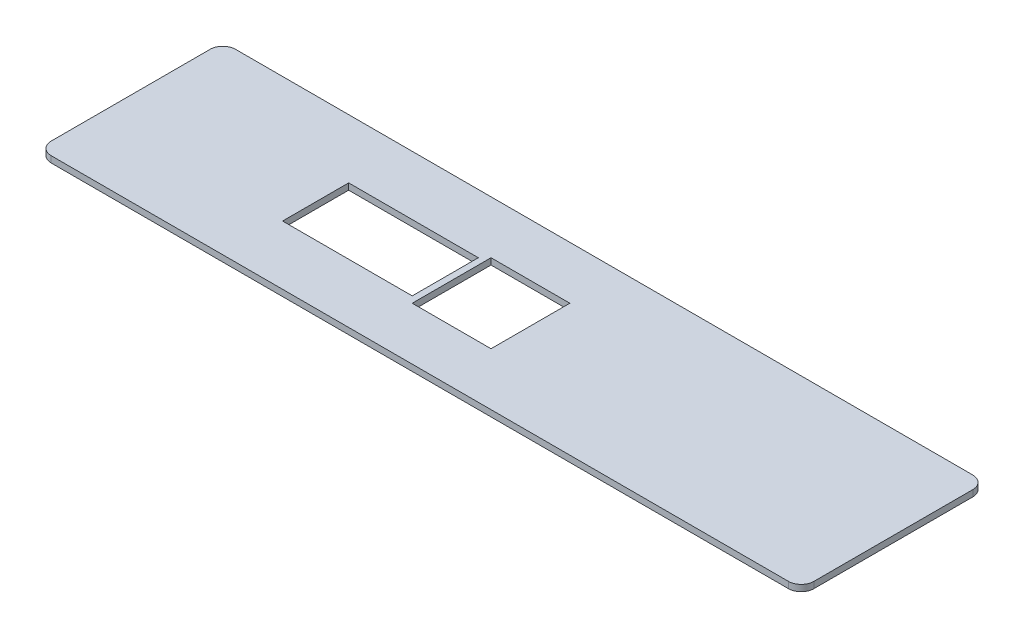
ISO-10303-21;
HEADER;
FILE_DESCRIPTION(('STEP AP214'),'2;1');
FILE_NAME('part.step','',(''),(''),'','','');
FILE_SCHEMA(('AUTOMOTIVE_DESIGN { 1 0 10303 214 1 1 1 1 }'));
ENDSEC;
DATA;
#1=APPLICATION_CONTEXT('core data for automotive mechanical design processes');
#2=APPLICATION_PROTOCOL_DEFINITION('international standard','automotive_design',2000,#1);
#3=PRODUCT_CONTEXT('',#1,'mechanical');
#4=PRODUCT('Part','Part','',(#3));
#5=PRODUCT_RELATED_PRODUCT_CATEGORY('part','',(#4));
#6=PRODUCT_DEFINITION_FORMATION('','',#4);
#7=PRODUCT_DEFINITION_CONTEXT('part definition',#1,'design');
#8=PRODUCT_DEFINITION('design','',#6,#7);
#9=PRODUCT_DEFINITION_SHAPE('','',#8);
#10=(LENGTH_UNIT() NAMED_UNIT(*) SI_UNIT(.MILLI.,.METRE.));
#11=(NAMED_UNIT(*) PLANE_ANGLE_UNIT() SI_UNIT($,.RADIAN.));
#12=(NAMED_UNIT(*) SI_UNIT($,.STERADIAN.) SOLID_ANGLE_UNIT());
#13=UNCERTAINTY_MEASURE_WITH_UNIT(LENGTH_MEASURE(1.E-05),#10,'distance_accuracy_value','');
#14=(GEOMETRIC_REPRESENTATION_CONTEXT(3) GLOBAL_UNCERTAINTY_ASSIGNED_CONTEXT((#13)) GLOBAL_UNIT_ASSIGNED_CONTEXT((#10,
#11,#12)) REPRESENTATION_CONTEXT('',''));
#15=CARTESIAN_POINT('',(0.,0.,0.));
#16=DIRECTION('',(0.,0.,1.));
#17=DIRECTION('',(1.,0.,0.));
#18=AXIS2_PLACEMENT_3D('',#15,#16,#17);
#19=CARTESIAN_POINT('',(118.,1.,-12.5));
#20=DIRECTION('',(0.,-1.,0.));
#21=DIRECTION('',(0.,0.,-1.));
#22=AXIS2_PLACEMENT_3D('',#19,#20,#21);
#23=PLANE('',#22);
#24=DIRECTION('',(0.,0.,1.));
#25=VECTOR('',#24,1.);
#26=CARTESIAN_POINT('',(29.1,1.,-5.2));
#27=LINE('',#26,#25);
#28=CARTESIAN_POINT('',(29.1,1.,-5.2));
#29=VERTEX_POINT('',#28);
#30=CARTESIAN_POINT('',(29.1,1.,5.2));
#31=VERTEX_POINT('',#30);
#32=EDGE_CURVE('E207',#29,#31,#27,.T.);
#33=ORIENTED_EDGE('',*,*,#32,.F.);
#34=DIRECTION('',(-1.,0.,0.));
#35=VECTOR('',#34,1.);
#36=CARTESIAN_POINT('',(29.1,1.,-5.2));
#37=LINE('',#36,#35);
#38=CARTESIAN_POINT('',(49.5,1.,-5.2));
#39=VERTEX_POINT('',#38);
#40=EDGE_CURVE('E218',#39,#29,#37,.T.);
#41=ORIENTED_EDGE('',*,*,#40,.F.);
#42=DIRECTION('',(0.,0.,-1.));
#43=VECTOR('',#42,1.);
#44=CARTESIAN_POINT('',(49.5,1.,-5.2));
#45=LINE('',#44,#43);
#46=CARTESIAN_POINT('',(49.5,1.,5.2));
#47=VERTEX_POINT('',#46);
#48=EDGE_CURVE('E214',#47,#39,#45,.T.);
#49=ORIENTED_EDGE('',*,*,#48,.F.);
#50=DIRECTION('',(1.,0.,0.));
#51=VECTOR('',#50,1.);
#52=CARTESIAN_POINT('',(29.1,1.,5.2));
#53=LINE('',#52,#51);
#54=EDGE_CURVE('E210',#31,#47,#53,.T.);
#55=ORIENTED_EDGE('',*,*,#54,.F.);
#56=EDGE_LOOP('',(#33,#41,#49,#55));
#57=FACE_BOUND('',#56,.T.);
#58=CARTESIAN_POINT('',(118.,1.,-12.5));
#59=DIRECTION('',(0.,1.,0.));
#60=DIRECTION('',(0.,0.,-1.));
#61=AXIS2_PLACEMENT_3D('',#58,#59,#60);
#62=CIRCLE('',#61,2.);
#63=CARTESIAN_POINT('',(120.,1.,-12.5));
#64=VERTEX_POINT('',#63);
#65=CARTESIAN_POINT('',(118.,1.,-14.5));
#66=VERTEX_POINT('',#65);
#67=EDGE_CURVE('E250',#64,#66,#62,.T.);
#68=ORIENTED_EDGE('',*,*,#67,.T.);
#69=DIRECTION('',(-1.,0.,0.));
#70=VECTOR('',#69,1.);
#71=CARTESIAN_POINT('',(118.,1.,-14.5));
#72=LINE('',#71,#70);
#73=CARTESIAN_POINT('',(2.00000000000001,1.,-14.5));
#74=VERTEX_POINT('',#73);
#75=EDGE_CURVE('E254',#66,#74,#72,.T.);
#76=ORIENTED_EDGE('',*,*,#75,.T.);
#77=CARTESIAN_POINT('',(1.99999999999999,1.,-12.5));
#78=DIRECTION('',(0.,1.,0.));
#79=DIRECTION('',(0.,0.,1.));
#80=AXIS2_PLACEMENT_3D('',#77,#78,#79);
#81=CIRCLE('',#80,2.);
#82=CARTESIAN_POINT('',(0.,1.,-12.5));
#83=VERTEX_POINT('',#82);
#84=EDGE_CURVE('E258',#74,#83,#81,.T.);
#85=ORIENTED_EDGE('',*,*,#84,.T.);
#86=DIRECTION('',(0.,0.,1.));
#87=VECTOR('',#86,1.);
#88=CARTESIAN_POINT('',(0.,1.,-12.5));
#89=LINE('',#88,#87);
#90=CARTESIAN_POINT('',(0.,1.,12.5));
#91=VERTEX_POINT('',#90);
#92=EDGE_CURVE('E261',#83,#91,#89,.T.);
#93=ORIENTED_EDGE('',*,*,#92,.T.);
#94=CARTESIAN_POINT('',(2.,1.,12.5));
#95=DIRECTION('',(0.,1.,0.));
#96=DIRECTION('',(0.,0.,-1.));
#97=AXIS2_PLACEMENT_3D('',#94,#95,#96);
#98=CIRCLE('',#97,2.);
#99=CARTESIAN_POINT('',(2.00000000000001,1.,14.5));
#100=VERTEX_POINT('',#99);
#101=EDGE_CURVE('E264',#91,#100,#98,.T.);
#102=ORIENTED_EDGE('',*,*,#101,.T.);
#103=DIRECTION('',(1.,0.,0.));
#104=VECTOR('',#103,1.);
#105=CARTESIAN_POINT('',(2.00000000000001,1.,14.5));
#106=LINE('',#105,#104);
#107=CARTESIAN_POINT('',(118.,1.,14.4999999999999));
#108=VERTEX_POINT('',#107);
#109=EDGE_CURVE('E267',#100,#108,#106,.T.);
#110=ORIENTED_EDGE('',*,*,#109,.T.);
#111=CARTESIAN_POINT('',(118.,1.,12.4999999999999));
#112=DIRECTION('',(0.,1.,0.));
#113=DIRECTION('',(0.,0.,-1.));
#114=AXIS2_PLACEMENT_3D('',#111,#112,#113);
#115=CIRCLE('',#114,2.);
#116=CARTESIAN_POINT('',(120.,1.,12.4999999999999));
#117=VERTEX_POINT('',#116);
#118=EDGE_CURVE('E270',#108,#117,#115,.T.);
#119=ORIENTED_EDGE('',*,*,#118,.T.);
#120=DIRECTION('',(0.,0.,-1.));
#121=VECTOR('',#120,1.);
#122=CARTESIAN_POINT('',(120.,1.,12.4999999999999));
#123=LINE('',#122,#121);
#124=EDGE_CURVE('E273',#117,#64,#123,.T.);
#125=ORIENTED_EDGE('',*,*,#124,.T.);
#126=EDGE_LOOP('',(#68,#76,#85,#93,#102,#110,#119,#125));
#127=FACE_BOUND('',#126,.T.);
#128=DIRECTION('',(0.,0.,1.));
#129=VECTOR('',#128,1.);
#130=CARTESIAN_POINT('',(50.5,1.,-6.2));
#131=LINE('',#130,#129);
#132=CARTESIAN_POINT('',(50.5,1.,-6.2));
#133=VERTEX_POINT('',#132);
#134=CARTESIAN_POINT('',(50.5,1.,6.2));
#135=VERTEX_POINT('',#134);
#136=EDGE_CURVE('E159',#133,#135,#131,.T.);
#137=ORIENTED_EDGE('',*,*,#136,.F.);
#138=DIRECTION('',(-1.,0.,0.));
#139=VECTOR('',#138,1.);
#140=CARTESIAN_POINT('',(50.5,1.,-6.2));
#141=LINE('',#140,#139);
#142=CARTESIAN_POINT('',(62.9,1.,-6.2));
#143=VERTEX_POINT('',#142);
#144=EDGE_CURVE('E185',#143,#133,#141,.T.);
#145=ORIENTED_EDGE('',*,*,#144,.F.);
#146=DIRECTION('',(0.,0.,-1.));
#147=VECTOR('',#146,1.);
#148=CARTESIAN_POINT('',(62.9,1.,-6.2));
#149=LINE('',#148,#147);
#150=CARTESIAN_POINT('',(62.9,1.,6.2));
#151=VERTEX_POINT('',#150);
#152=EDGE_CURVE('E181',#151,#143,#149,.T.);
#153=ORIENTED_EDGE('',*,*,#152,.F.);
#154=DIRECTION('',(1.,0.,0.));
#155=VECTOR('',#154,1.);
#156=CARTESIAN_POINT('',(50.5,1.,6.2));
#157=LINE('',#156,#155);
#158=EDGE_CURVE('E168',#135,#151,#157,.T.);
#159=ORIENTED_EDGE('',*,*,#158,.F.);
#160=EDGE_LOOP('',(#137,#145,#153,#159));
#161=FACE_BOUND('',#160,.T.);
#162=ADVANCED_FACE('F45',(#57,#127,#161),#23,.F.);
#163=CARTESIAN_POINT('',(118.,0.,-12.5));
#164=DIRECTION('',(0.,-1.,0.));
#165=DIRECTION('',(0.,0.,-1.));
#166=AXIS2_PLACEMENT_3D('',#163,#164,#165);
#167=PLANE('',#166);
#168=CARTESIAN_POINT('',(118.,0.,-12.5));
#169=DIRECTION('',(0.,1.,0.));
#170=DIRECTION('',(0.,0.,-1.));
#171=AXIS2_PLACEMENT_3D('',#168,#169,#170);
#172=CIRCLE('',#171,2.);
#173=CARTESIAN_POINT('',(120.,0.,-12.5));
#174=VERTEX_POINT('',#173);
#175=CARTESIAN_POINT('',(118.,0.,-14.5));
#176=VERTEX_POINT('',#175);
#177=EDGE_CURVE('E249',#174,#176,#172,.T.);
#178=ORIENTED_EDGE('',*,*,#177,.F.);
#179=DIRECTION('',(0.,0.,-1.));
#180=VECTOR('',#179,1.);
#181=CARTESIAN_POINT('',(120.,0.,12.4999999999999));
#182=LINE('',#181,#180);
#183=CARTESIAN_POINT('',(120.,0.,12.4999999999999));
#184=VERTEX_POINT('',#183);
#185=EDGE_CURVE('E255',#184,#174,#182,.T.);
#186=ORIENTED_EDGE('',*,*,#185,.F.);
#187=CARTESIAN_POINT('',(118.,0.,12.4999999999999));
#188=DIRECTION('',(0.,1.,0.));
#189=DIRECTION('',(0.,0.,-1.));
#190=AXIS2_PLACEMENT_3D('',#187,#188,#189);
#191=CIRCLE('',#190,2.);
#192=CARTESIAN_POINT('',(118.,0.,14.4999999999999));
#193=VERTEX_POINT('',#192);
#194=EDGE_CURVE('E295',#193,#184,#191,.T.);
#195=ORIENTED_EDGE('',*,*,#194,.F.);
#196=DIRECTION('',(1.,0.,0.));
#197=VECTOR('',#196,1.);
#198=CARTESIAN_POINT('',(2.00000000000001,0.,14.5));
#199=LINE('',#198,#197);
#200=CARTESIAN_POINT('',(2.00000000000001,0.,14.5));
#201=VERTEX_POINT('',#200);
#202=EDGE_CURVE('E292',#201,#193,#199,.T.);
#203=ORIENTED_EDGE('',*,*,#202,.F.);
#204=CARTESIAN_POINT('',(2.,0.,12.5));
#205=DIRECTION('',(0.,1.,0.));
#206=DIRECTION('',(0.,0.,-1.));
#207=AXIS2_PLACEMENT_3D('',#204,#205,#206);
#208=CIRCLE('',#207,2.);
#209=CARTESIAN_POINT('',(0.,0.,12.5));
#210=VERTEX_POINT('',#209);
#211=EDGE_CURVE('E289',#210,#201,#208,.T.);
#212=ORIENTED_EDGE('',*,*,#211,.F.);
#213=DIRECTION('',(0.,0.,1.));
#214=VECTOR('',#213,1.);
#215=CARTESIAN_POINT('',(0.,0.,-12.5));
#216=LINE('',#215,#214);
#217=CARTESIAN_POINT('',(0.,0.,-12.5));
#218=VERTEX_POINT('',#217);
#219=EDGE_CURVE('E286',#218,#210,#216,.T.);
#220=ORIENTED_EDGE('',*,*,#219,.F.);
#221=CARTESIAN_POINT('',(1.99999999999999,0.,-12.5));
#222=DIRECTION('',(0.,1.,0.));
#223=DIRECTION('',(0.,0.,1.));
#224=AXIS2_PLACEMENT_3D('',#221,#222,#223);
#225=CIRCLE('',#224,2.);
#226=CARTESIAN_POINT('',(2.00000000000001,0.,-14.5));
#227=VERTEX_POINT('',#226);
#228=EDGE_CURVE('E283',#227,#218,#225,.T.);
#229=ORIENTED_EDGE('',*,*,#228,.F.);
#230=DIRECTION('',(-1.,0.,0.));
#231=VECTOR('',#230,1.);
#232=CARTESIAN_POINT('',(118.,0.,-14.5));
#233=LINE('',#232,#231);
#234=EDGE_CURVE('E280',#176,#227,#233,.T.);
#235=ORIENTED_EDGE('',*,*,#234,.F.);
#236=EDGE_LOOP('',(#178,#186,#195,#203,#212,#220,#229,#235));
#237=FACE_BOUND('',#236,.T.);
#238=DIRECTION('',(-1.,0.,0.));
#239=VECTOR('',#238,1.);
#240=CARTESIAN_POINT('',(29.1,0.,-5.2));
#241=LINE('',#240,#239);
#242=CARTESIAN_POINT('',(49.5,0.,-5.2));
#243=VERTEX_POINT('',#242);
#244=CARTESIAN_POINT('',(29.1,0.,-5.2));
#245=VERTEX_POINT('',#244);
#246=EDGE_CURVE('E211',#243,#245,#241,.T.);
#247=ORIENTED_EDGE('',*,*,#246,.T.);
#248=DIRECTION('',(0.,0.,1.));
#249=VECTOR('',#248,1.);
#250=CARTESIAN_POINT('',(29.1,0.,-5.2));
#251=LINE('',#250,#249);
#252=CARTESIAN_POINT('',(29.1,0.,5.2));
#253=VERTEX_POINT('',#252);
#254=EDGE_CURVE('E177',#245,#253,#251,.T.);
#255=ORIENTED_EDGE('',*,*,#254,.T.);
#256=DIRECTION('',(1.,0.,0.));
#257=VECTOR('',#256,1.);
#258=CARTESIAN_POINT('',(29.1,0.,5.2));
#259=LINE('',#258,#257);
#260=CARTESIAN_POINT('',(49.5,0.,5.2));
#261=VERTEX_POINT('',#260);
#262=EDGE_CURVE('E225',#253,#261,#259,.T.);
#263=ORIENTED_EDGE('',*,*,#262,.T.);
#264=DIRECTION('',(0.,0.,-1.));
#265=VECTOR('',#264,1.);
#266=CARTESIAN_POINT('',(49.5,0.,-5.2));
#267=LINE('',#266,#265);
#268=EDGE_CURVE('E229',#261,#243,#267,.T.);
#269=ORIENTED_EDGE('',*,*,#268,.T.);
#270=EDGE_LOOP('',(#247,#255,#263,#269));
#271=FACE_BOUND('',#270,.T.);
#272=DIRECTION('',(-1.,0.,0.));
#273=VECTOR('',#272,1.);
#274=CARTESIAN_POINT('',(50.5,0.,-6.2));
#275=LINE('',#274,#273);
#276=CARTESIAN_POINT('',(62.9,0.,-6.2));
#277=VERTEX_POINT('',#276);
#278=CARTESIAN_POINT('',(50.5,0.,-6.2));
#279=VERTEX_POINT('',#278);
#280=EDGE_CURVE('E169',#277,#279,#275,.T.);
#281=ORIENTED_EDGE('',*,*,#280,.T.);
#282=DIRECTION('',(0.,0.,1.));
#283=VECTOR('',#282,1.);
#284=CARTESIAN_POINT('',(50.5,0.,-6.2));
#285=LINE('',#284,#283);
#286=CARTESIAN_POINT('',(50.5,0.,6.2));
#287=VERTEX_POINT('',#286);
#288=EDGE_CURVE('E69',#279,#287,#285,.T.);
#289=ORIENTED_EDGE('',*,*,#288,.T.);
#290=DIRECTION('',(1.,0.,0.));
#291=VECTOR('',#290,1.);
#292=CARTESIAN_POINT('',(50.5,0.,6.2));
#293=LINE('',#292,#291);
#294=CARTESIAN_POINT('',(62.9,0.,6.2));
#295=VERTEX_POINT('',#294);
#296=EDGE_CURVE('E175',#287,#295,#293,.T.);
#297=ORIENTED_EDGE('',*,*,#296,.T.);
#298=DIRECTION('',(0.,0.,-1.));
#299=VECTOR('',#298,1.);
#300=CARTESIAN_POINT('',(62.9,0.,-6.2));
#301=LINE('',#300,#299);
#302=EDGE_CURVE('E194',#295,#277,#301,.T.);
#303=ORIENTED_EDGE('',*,*,#302,.T.);
#304=EDGE_LOOP('',(#281,#289,#297,#303));
#305=FACE_BOUND('',#304,.T.);
#306=ADVANCED_FACE('F334',(#237,#271,#305),#167,.T.);
#307=CARTESIAN_POINT('',(118.,1.,-12.5));
#308=DIRECTION('',(0.,-1.,0.));
#309=DIRECTION('',(0.,0.,-1.));
#310=AXIS2_PLACEMENT_3D('',#307,#308,#309);
#311=CYLINDRICAL_SURFACE('',#310,2.);
#312=ORIENTED_EDGE('',*,*,#177,.T.);
#313=DIRECTION('',(0.,-1.,0.));
#314=VECTOR('',#313,1.);
#315=CARTESIAN_POINT('',(118.,1.,-14.5));
#316=LINE('',#315,#314);
#317=EDGE_CURVE('E11',#66,#176,#316,.T.);
#318=ORIENTED_EDGE('',*,*,#317,.F.);
#319=ORIENTED_EDGE('',*,*,#67,.F.);
#320=DIRECTION('',(0.,-1.,0.));
#321=VECTOR('',#320,1.);
#322=CARTESIAN_POINT('',(120.,1.,-12.5));
#323=LINE('',#322,#321);
#324=EDGE_CURVE('E276',#64,#174,#323,.T.);
#325=ORIENTED_EDGE('',*,*,#324,.T.);
#326=EDGE_LOOP('',(#312,#318,#319,#325));
#327=FACE_BOUND('',#326,.T.);
#328=ADVANCED_FACE('F47',(#327),#311,.T.);
#329=CARTESIAN_POINT('',(118.,1.,-14.5));
#330=DIRECTION('',(0.,0.,1.));
#331=DIRECTION('',(1.,0.,0.));
#332=AXIS2_PLACEMENT_3D('',#329,#330,#331);
#333=PLANE('',#332);
#334=ORIENTED_EDGE('',*,*,#234,.T.);
#335=DIRECTION('',(0.,-1.,0.));
#336=VECTOR('',#335,1.);
#337=CARTESIAN_POINT('',(2.00000000000001,1.,-14.5));
#338=LINE('',#337,#336);
#339=EDGE_CURVE('E54',#74,#227,#338,.T.);
#340=ORIENTED_EDGE('',*,*,#339,.F.);
#341=ORIENTED_EDGE('',*,*,#75,.F.);
#342=ORIENTED_EDGE('',*,*,#317,.T.);
#343=EDGE_LOOP('',(#334,#340,#341,#342));
#344=FACE_BOUND('',#343,.T.);
#345=ADVANCED_FACE('F351',(#344),#333,.F.);
#346=CARTESIAN_POINT('',(1.99999999999999,1.,-12.5));
#347=DIRECTION('',(0.,-1.,0.));
#348=DIRECTION('',(0.,0.,-1.));
#349=AXIS2_PLACEMENT_3D('',#346,#347,#348);
#350=CYLINDRICAL_SURFACE('',#349,2.);
#351=ORIENTED_EDGE('',*,*,#228,.T.);
#352=DIRECTION('',(0.,-1.,0.));
#353=VECTOR('',#352,1.);
#354=CARTESIAN_POINT('',(0.,1.,-12.5));
#355=LINE('',#354,#353);
#356=EDGE_CURVE('E319',#83,#218,#355,.T.);
#357=ORIENTED_EDGE('',*,*,#356,.F.);
#358=ORIENTED_EDGE('',*,*,#84,.F.);
#359=ORIENTED_EDGE('',*,*,#339,.T.);
#360=EDGE_LOOP('',(#351,#357,#358,#359));
#361=FACE_BOUND('',#360,.T.);
#362=ADVANCED_FACE('F328',(#361),#350,.T.);
#363=CARTESIAN_POINT('',(0.,1.,-12.5));
#364=DIRECTION('',(1.,0.,0.));
#365=DIRECTION('',(0.,0.,-1.));
#366=AXIS2_PLACEMENT_3D('',#363,#364,#365);
#367=PLANE('',#366);
#368=ORIENTED_EDGE('',*,*,#219,.T.);
#369=DIRECTION('',(0.,-1.,0.));
#370=VECTOR('',#369,1.);
#371=CARTESIAN_POINT('',(0.,1.,12.5));
#372=LINE('',#371,#370);
#373=EDGE_CURVE('E315',#91,#210,#372,.T.);
#374=ORIENTED_EDGE('',*,*,#373,.F.);
#375=ORIENTED_EDGE('',*,*,#92,.F.);
#376=ORIENTED_EDGE('',*,*,#356,.T.);
#377=EDGE_LOOP('',(#368,#374,#375,#376));
#378=FACE_BOUND('',#377,.T.);
#379=ADVANCED_FACE('F340',(#378),#367,.F.);
#380=CARTESIAN_POINT('',(2.,1.,12.5));
#381=DIRECTION('',(0.,-1.,0.));
#382=DIRECTION('',(0.,0.,-1.));
#383=AXIS2_PLACEMENT_3D('',#380,#381,#382);
#384=CYLINDRICAL_SURFACE('',#383,2.);
#385=ORIENTED_EDGE('',*,*,#211,.T.);
#386=DIRECTION('',(0.,-1.,0.));
#387=VECTOR('',#386,1.);
#388=CARTESIAN_POINT('',(2.00000000000001,1.,14.5));
#389=LINE('',#388,#387);
#390=EDGE_CURVE('E311',#100,#201,#389,.T.);
#391=ORIENTED_EDGE('',*,*,#390,.F.);
#392=ORIENTED_EDGE('',*,*,#101,.F.);
#393=ORIENTED_EDGE('',*,*,#373,.T.);
#394=EDGE_LOOP('',(#385,#391,#392,#393));
#395=FACE_BOUND('',#394,.T.);
#396=ADVANCED_FACE('F344',(#395),#384,.T.);
#397=CARTESIAN_POINT('',(2.00000000000001,1.,14.5));
#398=DIRECTION('',(0.,0.,-1.));
#399=DIRECTION('',(-1.,0.,0.));
#400=AXIS2_PLACEMENT_3D('',#397,#398,#399);
#401=PLANE('',#400);
#402=ORIENTED_EDGE('',*,*,#202,.T.);
#403=DIRECTION('',(0.,-1.,0.));
#404=VECTOR('',#403,1.);
#405=CARTESIAN_POINT('',(118.,1.,14.4999999999999));
#406=LINE('',#405,#404);
#407=EDGE_CURVE('E307',#108,#193,#406,.T.);
#408=ORIENTED_EDGE('',*,*,#407,.F.);
#409=ORIENTED_EDGE('',*,*,#109,.F.);
#410=ORIENTED_EDGE('',*,*,#390,.T.);
#411=EDGE_LOOP('',(#402,#408,#409,#410));
#412=FACE_BOUND('',#411,.T.);
#413=ADVANCED_FACE('F364',(#412),#401,.F.);
#414=CARTESIAN_POINT('',(118.,1.,12.4999999999999));
#415=DIRECTION('',(0.,-1.,0.));
#416=DIRECTION('',(0.,0.,-1.));
#417=AXIS2_PLACEMENT_3D('',#414,#415,#416);
#418=CYLINDRICAL_SURFACE('',#417,2.);
#419=ORIENTED_EDGE('',*,*,#194,.T.);
#420=DIRECTION('',(0.,-1.,0.));
#421=VECTOR('',#420,1.);
#422=CARTESIAN_POINT('',(120.,1.,12.4999999999999));
#423=LINE('',#422,#421);
#424=EDGE_CURVE('E303',#117,#184,#423,.T.);
#425=ORIENTED_EDGE('',*,*,#424,.F.);
#426=ORIENTED_EDGE('',*,*,#118,.F.);
#427=ORIENTED_EDGE('',*,*,#407,.T.);
#428=EDGE_LOOP('',(#419,#425,#426,#427));
#429=FACE_BOUND('',#428,.T.);
#430=ADVANCED_FACE('F362',(#429),#418,.T.);
#431=CARTESIAN_POINT('',(120.,1.,12.4999999999999));
#432=DIRECTION('',(-1.,0.,0.));
#433=DIRECTION('',(0.,0.,1.));
#434=AXIS2_PLACEMENT_3D('',#431,#432,#433);
#435=PLANE('',#434);
#436=ORIENTED_EDGE('',*,*,#185,.T.);
#437=ORIENTED_EDGE('',*,*,#324,.F.);
#438=ORIENTED_EDGE('',*,*,#124,.F.);
#439=ORIENTED_EDGE('',*,*,#424,.T.);
#440=EDGE_LOOP('',(#436,#437,#438,#439));
#441=FACE_BOUND('',#440,.T.);
#442=ADVANCED_FACE('F357',(#441),#435,.F.);
#443=CARTESIAN_POINT('',(29.1,1.,-5.2));
#444=DIRECTION('',(1.,0.,0.));
#445=DIRECTION('',(0.,0.,-1.));
#446=AXIS2_PLACEMENT_3D('',#443,#444,#445);
#447=PLANE('',#446);
#448=ORIENTED_EDGE('',*,*,#254,.F.);
#449=DIRECTION('',(0.,-1.,0.));
#450=VECTOR('',#449,1.);
#451=CARTESIAN_POINT('',(29.1,1.,-5.2));
#452=LINE('',#451,#450);
#453=EDGE_CURVE('E221',#29,#245,#452,.T.);
#454=ORIENTED_EDGE('',*,*,#453,.F.);
#455=ORIENTED_EDGE('',*,*,#32,.T.);
#456=DIRECTION('',(0.,-1.,0.));
#457=VECTOR('',#456,1.);
#458=CARTESIAN_POINT('',(29.1,1.,5.2));
#459=LINE('',#458,#457);
#460=EDGE_CURVE('E245',#31,#253,#459,.T.);
#461=ORIENTED_EDGE('',*,*,#460,.T.);
#462=EDGE_LOOP('',(#448,#454,#455,#461));
#463=FACE_BOUND('',#462,.T.);
#464=ADVANCED_FACE('F382',(#463),#447,.T.);
#465=CARTESIAN_POINT('',(29.1,1.,5.2));
#466=DIRECTION('',(0.,0.,-1.));
#467=DIRECTION('',(-1.,0.,0.));
#468=AXIS2_PLACEMENT_3D('',#465,#466,#467);
#469=PLANE('',#468);
#470=ORIENTED_EDGE('',*,*,#262,.F.);
#471=ORIENTED_EDGE('',*,*,#460,.F.);
#472=ORIENTED_EDGE('',*,*,#54,.T.);
#473=DIRECTION('',(0.,-1.,0.));
#474=VECTOR('',#473,1.);
#475=CARTESIAN_POINT('',(49.5,1.,5.2));
#476=LINE('',#475,#474);
#477=EDGE_CURVE('E242',#47,#261,#476,.T.);
#478=ORIENTED_EDGE('',*,*,#477,.T.);
#479=EDGE_LOOP('',(#470,#471,#472,#478));
#480=FACE_BOUND('',#479,.T.);
#481=ADVANCED_FACE('F389',(#480),#469,.T.);
#482=CARTESIAN_POINT('',(49.5,1.,-5.2));
#483=DIRECTION('',(-1.,0.,0.));
#484=DIRECTION('',(0.,0.,1.));
#485=AXIS2_PLACEMENT_3D('',#482,#483,#484);
#486=PLANE('',#485);
#487=ORIENTED_EDGE('',*,*,#268,.F.);
#488=ORIENTED_EDGE('',*,*,#477,.F.);
#489=ORIENTED_EDGE('',*,*,#48,.T.);
#490=DIRECTION('',(0.,-1.,0.));
#491=VECTOR('',#490,1.);
#492=CARTESIAN_POINT('',(49.5,1.,-5.2));
#493=LINE('',#492,#491);
#494=EDGE_CURVE('E239',#39,#243,#493,.T.);
#495=ORIENTED_EDGE('',*,*,#494,.T.);
#496=EDGE_LOOP('',(#487,#488,#489,#495));
#497=FACE_BOUND('',#496,.T.);
#498=ADVANCED_FACE('F394',(#497),#486,.T.);
#499=CARTESIAN_POINT('',(29.1,1.,-5.2));
#500=DIRECTION('',(0.,0.,1.));
#501=DIRECTION('',(1.,0.,0.));
#502=AXIS2_PLACEMENT_3D('',#499,#500,#501);
#503=PLANE('',#502);
#504=ORIENTED_EDGE('',*,*,#246,.F.);
#505=ORIENTED_EDGE('',*,*,#494,.F.);
#506=ORIENTED_EDGE('',*,*,#40,.T.);
#507=ORIENTED_EDGE('',*,*,#453,.T.);
#508=EDGE_LOOP('',(#504,#505,#506,#507));
#509=FACE_BOUND('',#508,.T.);
#510=ADVANCED_FACE('F400',(#509),#503,.T.);
#511=CARTESIAN_POINT('',(50.5,1.,-6.2));
#512=DIRECTION('',(1.,0.,0.));
#513=DIRECTION('',(0.,0.,-1.));
#514=AXIS2_PLACEMENT_3D('',#511,#512,#513);
#515=PLANE('',#514);
#516=ORIENTED_EDGE('',*,*,#288,.F.);
#517=DIRECTION('',(0.,-1.,0.));
#518=VECTOR('',#517,1.);
#519=CARTESIAN_POINT('',(50.5,1.,-6.2));
#520=LINE('',#519,#518);
#521=EDGE_CURVE('E163',#133,#279,#520,.T.);
#522=ORIENTED_EDGE('',*,*,#521,.F.);
#523=ORIENTED_EDGE('',*,*,#136,.T.);
#524=DIRECTION('',(0.,-1.,0.));
#525=VECTOR('',#524,1.);
#526=CARTESIAN_POINT('',(50.5,1.,6.2));
#527=LINE('',#526,#525);
#528=EDGE_CURVE('E162',#135,#287,#527,.T.);
#529=ORIENTED_EDGE('',*,*,#528,.T.);
#530=EDGE_LOOP('',(#516,#522,#523,#529));
#531=FACE_BOUND('',#530,.T.);
#532=ADVANCED_FACE('F161',(#531),#515,.T.);
#533=CARTESIAN_POINT('',(50.5,1.,6.2));
#534=DIRECTION('',(0.,0.,-1.));
#535=DIRECTION('',(-1.,0.,0.));
#536=AXIS2_PLACEMENT_3D('',#533,#534,#535);
#537=PLANE('',#536);
#538=ORIENTED_EDGE('',*,*,#296,.F.);
#539=ORIENTED_EDGE('',*,*,#528,.F.);
#540=ORIENTED_EDGE('',*,*,#158,.T.);
#541=DIRECTION('',(0.,-1.,0.));
#542=VECTOR('',#541,1.);
#543=CARTESIAN_POINT('',(62.9,1.,6.2));
#544=LINE('',#543,#542);
#545=EDGE_CURVE('E178',#151,#295,#544,.T.);
#546=ORIENTED_EDGE('',*,*,#545,.T.);
#547=EDGE_LOOP('',(#538,#539,#540,#546));
#548=FACE_BOUND('',#547,.T.);
#549=ADVANCED_FACE('F172',(#548),#537,.T.);
#550=CARTESIAN_POINT('',(62.9,1.,-6.2));
#551=DIRECTION('',(-1.,0.,0.));
#552=DIRECTION('',(0.,0.,1.));
#553=AXIS2_PLACEMENT_3D('',#550,#551,#552);
#554=PLANE('',#553);
#555=ORIENTED_EDGE('',*,*,#302,.F.);
#556=ORIENTED_EDGE('',*,*,#545,.F.);
#557=ORIENTED_EDGE('',*,*,#152,.T.);
#558=DIRECTION('',(0.,-1.,0.));
#559=VECTOR('',#558,1.);
#560=CARTESIAN_POINT('',(62.9,1.,-6.2));
#561=LINE('',#560,#559);
#562=EDGE_CURVE('E61',#143,#277,#561,.T.);
#563=ORIENTED_EDGE('',*,*,#562,.T.);
#564=EDGE_LOOP('',(#555,#556,#557,#563));
#565=FACE_BOUND('',#564,.T.);
#566=ADVANCED_FACE('F419',(#565),#554,.T.);
#567=CARTESIAN_POINT('',(50.5,1.,-6.2));
#568=DIRECTION('',(0.,0.,1.));
#569=DIRECTION('',(1.,0.,0.));
#570=AXIS2_PLACEMENT_3D('',#567,#568,#569);
#571=PLANE('',#570);
#572=ORIENTED_EDGE('',*,*,#280,.F.);
#573=ORIENTED_EDGE('',*,*,#562,.F.);
#574=ORIENTED_EDGE('',*,*,#144,.T.);
#575=ORIENTED_EDGE('',*,*,#521,.T.);
#576=EDGE_LOOP('',(#572,#573,#574,#575));
#577=FACE_BOUND('',#576,.T.);
#578=ADVANCED_FACE('F422',(#577),#571,.T.);
#579=CLOSED_SHELL('',(#162,#306,#328,#345,#362,#379,#396,#413,#430,#442,#464,#481,#498,#510,
#532,#549,#566,#578));
#580=MANIFOLD_SOLID_BREP('B2',#579);
#581=ADVANCED_BREP_SHAPE_REPRESENTATION('',(#18,#580),#14);
#582=SHAPE_DEFINITION_REPRESENTATION(#9,#581);
ENDSEC;
END-ISO-10303-21;
